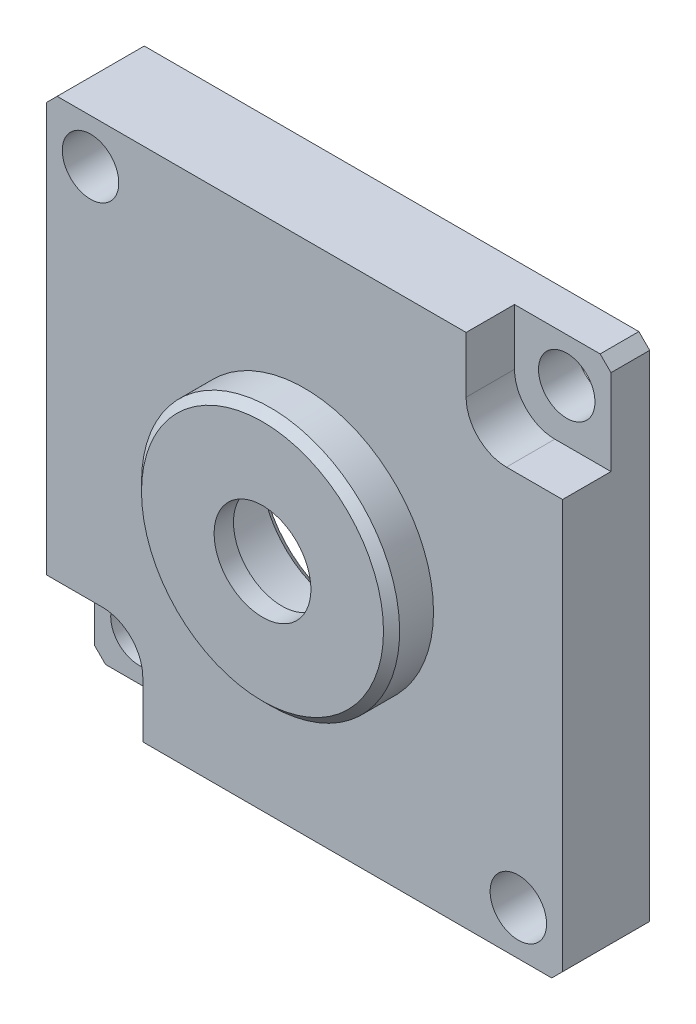
ISO-10303-21;
HEADER;
FILE_DESCRIPTION(('STEP AP214'),'2;1');
FILE_NAME('part.step','',(''),(''),'','','');
FILE_SCHEMA(('AUTOMOTIVE_DESIGN { 1 0 10303 214 1 1 1 1 }'));
ENDSEC;
DATA;
#1=APPLICATION_CONTEXT('core data for automotive mechanical design processes');
#2=APPLICATION_PROTOCOL_DEFINITION('international standard','automotive_design',2000,#1);
#3=PRODUCT_CONTEXT('',#1,'mechanical');
#4=PRODUCT('Part','Part','',(#3));
#5=PRODUCT_RELATED_PRODUCT_CATEGORY('part','',(#4));
#6=PRODUCT_DEFINITION_FORMATION('','',#4);
#7=PRODUCT_DEFINITION_CONTEXT('part definition',#1,'design');
#8=PRODUCT_DEFINITION('design','',#6,#7);
#9=PRODUCT_DEFINITION_SHAPE('','',#8);
#10=(LENGTH_UNIT() NAMED_UNIT(*) SI_UNIT(.MILLI.,.METRE.));
#11=(NAMED_UNIT(*) PLANE_ANGLE_UNIT() SI_UNIT($,.RADIAN.));
#12=(NAMED_UNIT(*) SI_UNIT($,.STERADIAN.) SOLID_ANGLE_UNIT());
#13=UNCERTAINTY_MEASURE_WITH_UNIT(LENGTH_MEASURE(1.E-05),#10,'distance_accuracy_value','');
#14=(GEOMETRIC_REPRESENTATION_CONTEXT(3) GLOBAL_UNCERTAINTY_ASSIGNED_CONTEXT((#13)) GLOBAL_UNIT_ASSIGNED_CONTEXT((#10,
#11,#12)) REPRESENTATION_CONTEXT('',''));
#15=CARTESIAN_POINT('',(0.,0.,0.));
#16=DIRECTION('',(0.,0.,1.));
#17=DIRECTION('',(1.,0.,0.));
#18=AXIS2_PLACEMENT_3D('',#15,#16,#17);
#19=CARTESIAN_POINT('',(0.,21.,6.5));
#20=DIRECTION('',(0.,0.,1.));
#21=DIRECTION('',(1.,0.,0.));
#22=AXIS2_PLACEMENT_3D('',#19,#20,#21);
#23=PLANE('',#22);
#24=CARTESIAN_POINT('',(0.,17.,6.5));
#25=DIRECTION('',(0.,0.,1.));
#26=DIRECTION('',(1.,0.,0.));
#27=AXIS2_PLACEMENT_3D('',#24,#25,#26);
#28=CIRCLE('',#27,4.);
#29=CARTESIAN_POINT('',(-4.,17.,6.5));
#30=VERTEX_POINT('',#29);
#31=EDGE_CURVE('E319',#30,#30,#28,.T.);
#32=ORIENTED_EDGE('',*,*,#31,.T.);
#33=EDGE_LOOP('',(#32));
#34=FACE_BOUND('',#33,.T.);
#35=CARTESIAN_POINT('',(0.,17.,6.5));
#36=DIRECTION('',(0.,0.,-1.));
#37=DIRECTION('',(1.,0.,0.));
#38=AXIS2_PLACEMENT_3D('',#35,#36,#37);
#39=CIRCLE('',#38,5.05);
#40=CARTESIAN_POINT('',(-5.05,17.,6.5));
#41=VERTEX_POINT('',#40);
#42=EDGE_CURVE('E316',#41,#41,#39,.T.);
#43=ORIENTED_EDGE('',*,*,#42,.T.);
#44=EDGE_LOOP('',(#43));
#45=FACE_BOUND('',#44,.T.);
#46=ADVANCED_FACE('F15',(#34,#45),#23,.F.);
#47=CARTESIAN_POINT('',(0.,21.,6.8));
#48=DIRECTION('',(0.,0.,1.));
#49=DIRECTION('',(1.,0.,0.));
#50=AXIS2_PLACEMENT_3D('',#47,#48,#49);
#51=PLANE('',#50);
#52=CARTESIAN_POINT('',(0.,17.,6.8));
#53=DIRECTION('',(0.,0.,1.));
#54=DIRECTION('',(1.,0.,0.));
#55=AXIS2_PLACEMENT_3D('',#52,#53,#54);
#56=CIRCLE('',#55,3.);
#57=CARTESIAN_POINT('',(-3.,17.,6.8));
#58=VERTEX_POINT('',#57);
#59=EDGE_CURVE('E289',#58,#58,#56,.T.);
#60=ORIENTED_EDGE('',*,*,#59,.T.);
#61=EDGE_LOOP('',(#60));
#62=FACE_BOUND('',#61,.T.);
#63=CARTESIAN_POINT('',(0.,17.,6.8));
#64=DIRECTION('',(0.,0.,1.));
#65=DIRECTION('',(1.,0.,0.));
#66=AXIS2_PLACEMENT_3D('',#63,#64,#65);
#67=CIRCLE('',#66,4.);
#68=CARTESIAN_POINT('',(-4.,17.,6.8));
#69=VERTEX_POINT('',#68);
#70=EDGE_CURVE('E234',#69,#69,#67,.T.);
#71=ORIENTED_EDGE('',*,*,#70,.F.);
#72=EDGE_LOOP('',(#71));
#73=FACE_BOUND('',#72,.T.);
#74=ADVANCED_FACE('F17',(#62,#73),#51,.F.);
#75=CARTESIAN_POINT('',(0.,30.,2.5));
#76=DIRECTION('',(0.,0.,1.));
#77=DIRECTION('',(1.,0.,0.));
#78=AXIS2_PLACEMENT_3D('',#75,#76,#77);
#79=PLANE('',#78);
#80=CARTESIAN_POINT('',(0.,17.,2.5));
#81=DIRECTION('',(0.,0.,-1.));
#82=DIRECTION('',(-1.,0.,0.));
#83=AXIS2_PLACEMENT_3D('',#80,#81,#82);
#84=CIRCLE('',#83,5.57573593122475);
#85=CARTESIAN_POINT('',(5.57573593122475,17.,2.5));
#86=VERTEX_POINT('',#85);
#87=EDGE_CURVE('E273',#86,#86,#84,.T.);
#88=ORIENTED_EDGE('',*,*,#87,.F.);
#89=EDGE_LOOP('',(#88));
#90=FACE_BOUND('',#89,.T.);
#91=CARTESIAN_POINT('',(0.,17.,2.5));
#92=DIRECTION('',(0.,0.,-1.));
#93=DIRECTION('',(1.,0.,0.));
#94=AXIS2_PLACEMENT_3D('',#91,#92,#93);
#95=CIRCLE('',#94,13.);
#96=CARTESIAN_POINT('',(-13.,17.,2.5));
#97=VERTEX_POINT('',#96);
#98=EDGE_CURVE('E294',#97,#97,#95,.T.);
#99=ORIENTED_EDGE('',*,*,#98,.T.);
#100=EDGE_LOOP('',(#99));
#101=FACE_BOUND('',#100,.T.);
#102=ADVANCED_FACE('F585',(#90,#101),#79,.F.);
#103=CARTESIAN_POINT('',(0.,25.,8.));
#104=DIRECTION('',(0.,0.,-1.));
#105=DIRECTION('',(-1.,0.,0.));
#106=AXIS2_PLACEMENT_3D('',#103,#104,#105);
#107=PLANE('',#106);
#108=CARTESIAN_POINT('',(0.,17.,8.));
#109=DIRECTION('',(0.,0.,1.));
#110=DIRECTION('',(1.,0.,0.));
#111=AXIS2_PLACEMENT_3D('',#108,#109,#110);
#112=CIRCLE('',#111,3.);
#113=CARTESIAN_POINT('',(-3.,17.,8.));
#114=VERTEX_POINT('',#113);
#115=EDGE_CURVE('E311',#114,#114,#112,.T.);
#116=ORIENTED_EDGE('',*,*,#115,.F.);
#117=EDGE_LOOP('',(#116));
#118=FACE_BOUND('',#117,.T.);
#119=CARTESIAN_POINT('',(0.,17.,8.));
#120=DIRECTION('',(0.,0.,-1.));
#121=DIRECTION('',(0.,1.,0.));
#122=AXIS2_PLACEMENT_3D('',#119,#120,#121);
#123=CIRCLE('',#122,7.5);
#124=CARTESIAN_POINT('',(0.,9.5,8.));
#125=VERTEX_POINT('',#124);
#126=EDGE_CURVE('E257',#125,#125,#123,.T.);
#127=ORIENTED_EDGE('',*,*,#126,.F.);
#128=EDGE_LOOP('',(#127));
#129=FACE_BOUND('',#128,.T.);
#130=ADVANCED_FACE('F588',(#118,#129),#107,.F.);
#131=CARTESIAN_POINT('',(-16.4142135623731,2.08578643762688,-42.4264068711929));
#132=DIRECTION('',(0.707106781186546,0.707106781186549,0.));
#133=DIRECTION('',(0.,0.,-1.));
#134=AXIS2_PLACEMENT_3D('',#131,#132,#133);
#135=PLANE('',#134);
#136=DIRECTION('',(0.,0.,1.));
#137=VECTOR('',#136,1.);
#138=CARTESIAN_POINT('',(-16.,1.6715728752538,-42.4264068711929));
#139=LINE('',#138,#137);
#140=CARTESIAN_POINT('',(-16.,1.67157287525379,0.));
#141=VERTEX_POINT('',#140);
#142=CARTESIAN_POINT('',(-16.,1.67157287525379,2.4));
#143=VERTEX_POINT('',#142);
#144=EDGE_CURVE('E399',#141,#143,#139,.T.);
#145=ORIENTED_EDGE('',*,*,#144,.F.);
#146=DIRECTION('',(0.707106781186549,-0.707106781186546,0.));
#147=VECTOR('',#146,1.);
#148=CARTESIAN_POINT('',(-19.5392135623731,5.21078643762685,0.));
#149=LINE('',#148,#147);
#150=CARTESIAN_POINT('',(-15.3284271247462,0.999999999999974,0.));
#151=VERTEX_POINT('',#150);
#152=EDGE_CURVE('E210',#141,#151,#149,.T.);
#153=ORIENTED_EDGE('',*,*,#152,.T.);
#154=DIRECTION('',(0.,0.,-1.));
#155=VECTOR('',#154,1.);
#156=CARTESIAN_POINT('',(-15.3284271247462,0.999999999999974,-42.4264068711929));
#157=LINE('',#156,#155);
#158=CARTESIAN_POINT('',(-15.3284271247462,0.999999999999974,2.4));
#159=VERTEX_POINT('',#158);
#160=EDGE_CURVE('E401',#159,#151,#157,.T.);
#161=ORIENTED_EDGE('',*,*,#160,.F.);
#162=DIRECTION('',(-0.707106781186549,0.707106781186546,0.));
#163=VECTOR('',#162,1.);
#164=CARTESIAN_POINT('',(-16.039213562373,1.71078643762683,2.4));
#165=LINE('',#164,#163);
#166=EDGE_CURVE('E329',#159,#143,#165,.T.);
#167=ORIENTED_EDGE('',*,*,#166,.T.);
#168=EDGE_LOOP('',(#145,#153,#161,#167));
#169=FACE_BOUND('',#168,.T.);
#170=ADVANCED_FACE('F554',(#169),#135,.F.);
#171=CARTESIAN_POINT('',(-14.9142135623731,33.4142135623731,-42.4264068711929));
#172=DIRECTION('',(0.707106781186549,-0.707106781186546,0.));
#173=DIRECTION('',(0.,0.,-1.));
#174=AXIS2_PLACEMENT_3D('',#171,#172,#173);
#175=PLANE('',#174);
#176=DIRECTION('',(0.,0.,1.));
#177=VECTOR('',#176,1.);
#178=CARTESIAN_POINT('',(-15.3284271247462,33.,-42.4264068711929));
#179=LINE('',#178,#177);
#180=CARTESIAN_POINT('',(-15.3284271247462,33.,0.));
#181=VERTEX_POINT('',#180);
#182=CARTESIAN_POINT('',(-15.3284271247462,33.,5.4));
#183=VERTEX_POINT('',#182);
#184=EDGE_CURVE('E457',#181,#183,#179,.T.);
#185=ORIENTED_EDGE('',*,*,#184,.F.);
#186=DIRECTION('',(-0.707106781186546,-0.707106781186549,0.));
#187=VECTOR('',#186,1.);
#188=CARTESIAN_POINT('',(-11.7892135623731,36.5392135623731,0.));
#189=LINE('',#188,#187);
#190=CARTESIAN_POINT('',(-16.,32.3284271247462,0.));
#191=VERTEX_POINT('',#190);
#192=EDGE_CURVE('E26',#181,#191,#189,.T.);
#193=ORIENTED_EDGE('',*,*,#192,.T.);
#194=DIRECTION('',(0.,0.,-1.));
#195=VECTOR('',#194,1.);
#196=CARTESIAN_POINT('',(-16.,32.3284271247462,-42.4264068711929));
#197=LINE('',#196,#195);
#198=CARTESIAN_POINT('',(-16.,32.3284271247462,5.4));
#199=VERTEX_POINT('',#198);
#200=EDGE_CURVE('E460',#199,#191,#197,.T.);
#201=ORIENTED_EDGE('',*,*,#200,.F.);
#202=DIRECTION('',(0.707106781186546,0.707106781186549,0.));
#203=VECTOR('',#202,1.);
#204=CARTESIAN_POINT('',(-15.2892135623731,33.039213562373,5.4));
#205=LINE('',#204,#203);
#206=EDGE_CURVE('E237',#199,#183,#205,.T.);
#207=ORIENTED_EDGE('',*,*,#206,.T.);
#208=EDGE_LOOP('',(#185,#193,#201,#207));
#209=FACE_BOUND('',#208,.T.);
#210=ADVANCED_FACE('F651',(#209),#175,.F.);
#211=CARTESIAN_POINT('',(14.9142135623731,0.585786437626887,-42.4264068711929));
#212=DIRECTION('',(-0.707106781186549,0.707106781186546,0.));
#213=DIRECTION('',(0.,0.,1.));
#214=AXIS2_PLACEMENT_3D('',#211,#212,#213);
#215=PLANE('',#214);
#216=DIRECTION('',(0.,0.,1.));
#217=VECTOR('',#216,1.);
#218=CARTESIAN_POINT('',(15.3284271247462,0.999999999999974,-42.4264068711929));
#219=LINE('',#218,#217);
#220=CARTESIAN_POINT('',(15.3284271247462,0.999999999999974,0.));
#221=VERTEX_POINT('',#220);
#222=CARTESIAN_POINT('',(15.3284271247462,0.999999999999974,5.4));
#223=VERTEX_POINT('',#222);
#224=EDGE_CURVE('E211',#221,#223,#219,.T.);
#225=ORIENTED_EDGE('',*,*,#224,.F.);
#226=DIRECTION('',(0.707106781186546,0.707106781186549,0.));
#227=VECTOR('',#226,1.);
#228=CARTESIAN_POINT('',(18.7892135623731,4.46078643762692,0.));
#229=LINE('',#228,#227);
#230=CARTESIAN_POINT('',(16.,1.67157287525379,0.));
#231=VERTEX_POINT('',#230);
#232=EDGE_CURVE('E10',#221,#231,#229,.T.);
#233=ORIENTED_EDGE('',*,*,#232,.T.);
#234=DIRECTION('',(0.,0.,-1.));
#235=VECTOR('',#234,1.);
#236=CARTESIAN_POINT('',(16.,1.67157287525379,-42.4264068711929));
#237=LINE('',#236,#235);
#238=CARTESIAN_POINT('',(16.,1.67157287525379,5.4));
#239=VERTEX_POINT('',#238);
#240=EDGE_CURVE('E227',#239,#231,#237,.T.);
#241=ORIENTED_EDGE('',*,*,#240,.F.);
#242=DIRECTION('',(-0.707106781186546,-0.707106781186549,0.));
#243=VECTOR('',#242,1.);
#244=CARTESIAN_POINT('',(15.2892135623731,0.96078643762691,5.4));
#245=LINE('',#244,#243);
#246=EDGE_CURVE('E430',#239,#223,#245,.T.);
#247=ORIENTED_EDGE('',*,*,#246,.T.);
#248=EDGE_LOOP('',(#225,#233,#241,#247));
#249=FACE_BOUND('',#248,.T.);
#250=ADVANCED_FACE('F599',(#249),#215,.F.);
#251=CARTESIAN_POINT('',(0.,31.,0.));
#252=DIRECTION('',(0.,0.,1.));
#253=DIRECTION('',(1.,0.,0.));
#254=AXIS2_PLACEMENT_3D('',#251,#252,#253);
#255=PLANE('',#254);
#256=CARTESIAN_POINT('',(0.,17.,0.));
#257=DIRECTION('',(0.,0.,-1.));
#258=DIRECTION('',(1.,0.,0.));
#259=AXIS2_PLACEMENT_3D('',#256,#257,#258);
#260=CIRCLE('',#259,13.);
#261=CARTESIAN_POINT('',(-13.,17.,0.));
#262=VERTEX_POINT('',#261);
#263=EDGE_CURVE('E261',#262,#262,#260,.T.);
#264=ORIENTED_EDGE('',*,*,#263,.F.);
#265=EDGE_LOOP('',(#264));
#266=FACE_BOUND('',#265,.T.);
#267=CARTESIAN_POINT('',(13.2582521472478,3.74174785275217,0.));
#268=DIRECTION('',(0.,0.,1.));
#269=DIRECTION('',(1.,0.,0.));
#270=AXIS2_PLACEMENT_3D('',#267,#268,#269);
#271=CIRCLE('',#270,1.75);
#272=CARTESIAN_POINT('',(11.5082521472478,3.74174785275217,0.));
#273=VERTEX_POINT('',#272);
#274=EDGE_CURVE('E360',#273,#273,#271,.T.);
#275=ORIENTED_EDGE('',*,*,#274,.T.);
#276=EDGE_LOOP('',(#275));
#277=FACE_BOUND('',#276,.T.);
#278=CARTESIAN_POINT('',(13.2582521472478,30.2582521472478,0.));
#279=DIRECTION('',(0.,0.,1.));
#280=DIRECTION('',(1.,0.,0.));
#281=AXIS2_PLACEMENT_3D('',#278,#279,#280);
#282=CIRCLE('',#281,1.75);
#283=CARTESIAN_POINT('',(11.5082521472478,30.2582521472478,0.));
#284=VERTEX_POINT('',#283);
#285=EDGE_CURVE('E271',#284,#284,#282,.T.);
#286=ORIENTED_EDGE('',*,*,#285,.T.);
#287=EDGE_LOOP('',(#286));
#288=FACE_BOUND('',#287,.T.);
#289=CARTESIAN_POINT('',(-13.2582521472479,3.74174785275228,0.));
#290=DIRECTION('',(0.,0.,1.));
#291=DIRECTION('',(1.,0.,0.));
#292=AXIS2_PLACEMENT_3D('',#289,#290,#291);
#293=CIRCLE('',#292,1.75);
#294=CARTESIAN_POINT('',(-15.0082521472479,3.74174785275228,0.));
#295=VERTEX_POINT('',#294);
#296=EDGE_CURVE('E272',#295,#295,#293,.T.);
#297=ORIENTED_EDGE('',*,*,#296,.T.);
#298=EDGE_LOOP('',(#297));
#299=FACE_BOUND('',#298,.T.);
#300=CARTESIAN_POINT('',(-13.2582521472478,30.2582521472478,0.));
#301=DIRECTION('',(0.,0.,1.));
#302=DIRECTION('',(1.,0.,0.));
#303=AXIS2_PLACEMENT_3D('',#300,#301,#302);
#304=CIRCLE('',#303,1.75);
#305=CARTESIAN_POINT('',(-15.0082521472478,30.2582521472478,0.));
#306=VERTEX_POINT('',#305);
#307=EDGE_CURVE('E288',#306,#306,#304,.T.);
#308=ORIENTED_EDGE('',*,*,#307,.T.);
#309=EDGE_LOOP('',(#308));
#310=FACE_BOUND('',#309,.T.);
#311=ORIENTED_EDGE('',*,*,#152,.F.);
#312=DIRECTION('',(0.,-1.,0.));
#313=VECTOR('',#312,1.);
#314=CARTESIAN_POINT('',(-16.,16.5,0.));
#315=LINE('',#314,#313);
#316=EDGE_CURVE('E402',#191,#141,#315,.T.);
#317=ORIENTED_EDGE('',*,*,#316,.F.);
#318=ORIENTED_EDGE('',*,*,#192,.F.);
#319=DIRECTION('',(-1.,0.,0.));
#320=VECTOR('',#319,1.);
#321=CARTESIAN_POINT('',(-7.5,33.,0.));
#322=LINE('',#321,#320);
#323=CARTESIAN_POINT('',(15.3284271247462,33.,0.));
#324=VERTEX_POINT('',#323);
#325=EDGE_CURVE('E206',#324,#181,#322,.T.);
#326=ORIENTED_EDGE('',*,*,#325,.F.);
#327=DIRECTION('',(0.707106781186549,-0.707106781186546,0.));
#328=VECTOR('',#327,1.);
#329=CARTESIAN_POINT('',(12.5392135623731,35.7892135623731,0.));
#330=LINE('',#329,#328);
#331=CARTESIAN_POINT('',(16.,32.3284271247462,0.));
#332=VERTEX_POINT('',#331);
#333=EDGE_CURVE('E199',#324,#332,#330,.T.);
#334=ORIENTED_EDGE('',*,*,#333,.T.);
#335=DIRECTION('',(0.,1.,0.));
#336=VECTOR('',#335,1.);
#337=CARTESIAN_POINT('',(16.,16.5,0.));
#338=LINE('',#337,#336);
#339=EDGE_CURVE('E203',#231,#332,#338,.T.);
#340=ORIENTED_EDGE('',*,*,#339,.F.);
#341=ORIENTED_EDGE('',*,*,#232,.F.);
#342=DIRECTION('',(1.,0.,0.));
#343=VECTOR('',#342,1.);
#344=CARTESIAN_POINT('',(-7.5,0.999999999999974,0.));
#345=LINE('',#344,#343);
#346=EDGE_CURVE('E416',#151,#221,#345,.T.);
#347=ORIENTED_EDGE('',*,*,#346,.F.);
#348=EDGE_LOOP('',(#311,#317,#318,#326,#334,#340,#341,#347));
#349=FACE_BOUND('',#348,.T.);
#350=ADVANCED_FACE('F201',(#266,#277,#288,#299,#310,#349),#255,.F.);
#351=CARTESIAN_POINT('',(16.4142135623731,31.9142135623731,-42.4264068711929));
#352=DIRECTION('',(-0.707106781186546,-0.707106781186549,0.));
#353=DIRECTION('',(-0.707106781186549,0.707106781186546,0.));
#354=AXIS2_PLACEMENT_3D('',#351,#352,#353);
#355=PLANE('',#354);
#356=DIRECTION('',(0.,0.,1.));
#357=VECTOR('',#356,1.);
#358=CARTESIAN_POINT('',(16.,32.3284271247462,-42.4264068711929));
#359=LINE('',#358,#357);
#360=CARTESIAN_POINT('',(16.,32.3284271247462,2.4));
#361=VERTEX_POINT('',#360);
#362=EDGE_CURVE('E215',#332,#361,#359,.T.);
#363=ORIENTED_EDGE('',*,*,#362,.F.);
#364=ORIENTED_EDGE('',*,*,#333,.F.);
#365=DIRECTION('',(0.,0.,-1.));
#366=VECTOR('',#365,1.);
#367=CARTESIAN_POINT('',(15.3284271247462,33.,-42.4264068711929));
#368=LINE('',#367,#366);
#369=CARTESIAN_POINT('',(15.3284271247462,33.,2.4));
#370=VERTEX_POINT('',#369);
#371=EDGE_CURVE('E223',#370,#324,#368,.T.);
#372=ORIENTED_EDGE('',*,*,#371,.F.);
#373=DIRECTION('',(0.707106781186549,-0.707106781186546,0.));
#374=VECTOR('',#373,1.);
#375=CARTESIAN_POINT('',(16.039213562373,32.2892135623732,2.4));
#376=LINE('',#375,#374);
#377=EDGE_CURVE('E218',#370,#361,#376,.T.);
#378=ORIENTED_EDGE('',*,*,#377,.T.);
#379=EDGE_LOOP('',(#363,#364,#372,#378));
#380=FACE_BOUND('',#379,.T.);
#381=ADVANCED_FACE('F216',(#380),#355,.F.);
#382=CARTESIAN_POINT('',(-15.,0.999999999999974,-42.4264068711929));
#383=DIRECTION('',(0.,-1.,0.));
#384=DIRECTION('',(0.,0.,-1.));
#385=AXIS2_PLACEMENT_3D('',#382,#383,#384);
#386=PLANE('',#385);
#387=DIRECTION('',(-1.,0.,0.));
#388=VECTOR('',#387,1.);
#389=CARTESIAN_POINT('',(-1.73959235991432,0.999999999999974,5.4));
#390=LINE('',#389,#388);
#391=CARTESIAN_POINT('',(-10.0208152801712,0.999999999999974,5.4));
#392=VERTEX_POINT('',#391);
#393=EDGE_CURVE('E244',#223,#392,#390,.T.);
#394=ORIENTED_EDGE('',*,*,#393,.T.);
#395=DIRECTION('',(0.,0.,-1.));
#396=VECTOR('',#395,1.);
#397=CARTESIAN_POINT('',(-10.0208152801712,0.99999999999997,-20.0132034355964));
#398=LINE('',#397,#396);
#399=CARTESIAN_POINT('',(-10.0208152801712,0.999999999999974,2.4));
#400=VERTEX_POINT('',#399);
#401=EDGE_CURVE('E266',#392,#400,#398,.T.);
#402=ORIENTED_EDGE('',*,*,#401,.T.);
#403=DIRECTION('',(-1.,0.,0.));
#404=VECTOR('',#403,1.);
#405=CARTESIAN_POINT('',(-13.2604076400856,0.999999999999974,2.4));
#406=LINE('',#405,#404);
#407=EDGE_CURVE('E304',#400,#159,#406,.T.);
#408=ORIENTED_EDGE('',*,*,#407,.T.);
#409=ORIENTED_EDGE('',*,*,#160,.T.);
#410=ORIENTED_EDGE('',*,*,#346,.T.);
#411=ORIENTED_EDGE('',*,*,#224,.T.);
#412=EDGE_LOOP('',(#394,#402,#408,#409,#410,#411));
#413=FACE_BOUND('',#412,.T.);
#414=ADVANCED_FACE('F556',(#413),#386,.T.);
#415=CARTESIAN_POINT('',(-16.,2.,-42.4264068711929));
#416=DIRECTION('',(-1.,0.,0.));
#417=DIRECTION('',(0.,1.,0.));
#418=AXIS2_PLACEMENT_3D('',#415,#416,#417);
#419=PLANE('',#418);
#420=DIRECTION('',(0.,1.,0.));
#421=VECTOR('',#420,1.);
#422=CARTESIAN_POINT('',(-16.,13.5,5.4));
#423=LINE('',#422,#421);
#424=CARTESIAN_POINT('',(-16.,6.97918471982857,5.4));
#425=VERTEX_POINT('',#424);
#426=EDGE_CURVE('E246',#425,#199,#423,.T.);
#427=ORIENTED_EDGE('',*,*,#426,.T.);
#428=ORIENTED_EDGE('',*,*,#200,.T.);
#429=ORIENTED_EDGE('',*,*,#316,.T.);
#430=ORIENTED_EDGE('',*,*,#144,.T.);
#431=DIRECTION('',(0.,1.,0.));
#432=VECTOR('',#431,1.);
#433=CARTESIAN_POINT('',(-16.,3.73959235991428,2.4));
#434=LINE('',#433,#432);
#435=CARTESIAN_POINT('',(-16.,6.97918471982857,2.4));
#436=VERTEX_POINT('',#435);
#437=EDGE_CURVE('E328',#143,#436,#434,.T.);
#438=ORIENTED_EDGE('',*,*,#437,.T.);
#439=DIRECTION('',(0.,0.,1.));
#440=VECTOR('',#439,1.);
#441=CARTESIAN_POINT('',(-16.,6.97918471982856,-20.0132034355964));
#442=LINE('',#441,#440);
#443=EDGE_CURVE('E335',#436,#425,#442,.T.);
#444=ORIENTED_EDGE('',*,*,#443,.T.);
#445=EDGE_LOOP('',(#427,#428,#429,#430,#438,#444));
#446=FACE_BOUND('',#445,.T.);
#447=ADVANCED_FACE('F516',(#446),#419,.T.);
#448=CARTESIAN_POINT('',(-15.,33.,-42.4264068711929));
#449=DIRECTION('',(0.,1.,0.));
#450=DIRECTION('',(1.,0.,0.));
#451=AXIS2_PLACEMENT_3D('',#448,#449,#450);
#452=PLANE('',#451);
#453=DIRECTION('',(1.,0.,0.));
#454=VECTOR('',#453,1.);
#455=CARTESIAN_POINT('',(-13.2604076400857,33.,5.4));
#456=LINE('',#455,#454);
#457=CARTESIAN_POINT('',(10.0208152801711,33.,5.4));
#458=VERTEX_POINT('',#457);
#459=EDGE_CURVE('E371',#183,#458,#456,.T.);
#460=ORIENTED_EDGE('',*,*,#459,.T.);
#461=DIRECTION('',(0.,0.,-1.));
#462=VECTOR('',#461,1.);
#463=CARTESIAN_POINT('',(10.0208152801711,33.,-20.0132034355964));
#464=LINE('',#463,#462);
#465=CARTESIAN_POINT('',(10.0208152801711,33.,2.4));
#466=VERTEX_POINT('',#465);
#467=EDGE_CURVE('E404',#458,#466,#464,.T.);
#468=ORIENTED_EDGE('',*,*,#467,.T.);
#469=DIRECTION('',(1.,0.,0.));
#470=VECTOR('',#469,1.);
#471=CARTESIAN_POINT('',(-1.73959235991443,33.,2.4));
#472=LINE('',#471,#470);
#473=EDGE_CURVE('E245',#466,#370,#472,.T.);
#474=ORIENTED_EDGE('',*,*,#473,.T.);
#475=ORIENTED_EDGE('',*,*,#371,.T.);
#476=ORIENTED_EDGE('',*,*,#325,.T.);
#477=ORIENTED_EDGE('',*,*,#184,.T.);
#478=EDGE_LOOP('',(#460,#468,#474,#475,#476,#477));
#479=FACE_BOUND('',#478,.T.);
#480=ADVANCED_FACE('F666',(#479),#452,.T.);
#481=CARTESIAN_POINT('',(16.,2.,-42.4264068711929));
#482=DIRECTION('',(1.,0.,0.));
#483=DIRECTION('',(0.,0.,-1.));
#484=AXIS2_PLACEMENT_3D('',#481,#482,#483);
#485=PLANE('',#484);
#486=DIRECTION('',(0.,-1.,0.));
#487=VECTOR('',#486,1.);
#488=CARTESIAN_POINT('',(16.,13.5,5.4));
#489=LINE('',#488,#487);
#490=CARTESIAN_POINT('',(16.,27.0208152801715,5.4));
#491=VERTEX_POINT('',#490);
#492=EDGE_CURVE('E374',#491,#239,#489,.T.);
#493=ORIENTED_EDGE('',*,*,#492,.T.);
#494=ORIENTED_EDGE('',*,*,#240,.T.);
#495=ORIENTED_EDGE('',*,*,#339,.T.);
#496=ORIENTED_EDGE('',*,*,#362,.T.);
#497=DIRECTION('',(0.,-1.,0.));
#498=VECTOR('',#497,1.);
#499=CARTESIAN_POINT('',(16.,15.2604076400857,2.4));
#500=LINE('',#499,#498);
#501=CARTESIAN_POINT('',(16.,27.0208152801715,2.4));
#502=VERTEX_POINT('',#501);
#503=EDGE_CURVE('E425',#361,#502,#500,.T.);
#504=ORIENTED_EDGE('',*,*,#503,.T.);
#505=DIRECTION('',(0.,0.,1.));
#506=VECTOR('',#505,1.);
#507=CARTESIAN_POINT('',(16.,27.0208152801715,-20.0132034355964));
#508=LINE('',#507,#506);
#509=EDGE_CURVE('E347',#502,#491,#508,.T.);
#510=ORIENTED_EDGE('',*,*,#509,.T.);
#511=EDGE_LOOP('',(#493,#494,#495,#496,#504,#510));
#512=FACE_BOUND('',#511,.T.);
#513=ADVANCED_FACE('F226',(#512),#485,.T.);
#514=CARTESIAN_POINT('',(0.,17.,5.4));
#515=DIRECTION('',(0.,0.,1.));
#516=DIRECTION('',(1.,0.,0.));
#517=AXIS2_PLACEMENT_3D('',#514,#515,#516);
#518=CYLINDRICAL_SURFACE('',#517,4.);
#519=ORIENTED_EDGE('',*,*,#31,.F.);
#520=DIRECTION('',(0.,0.,1.));
#521=VECTOR('',#520,1.);
#522=CARTESIAN_POINT('',(-4.,17.,5.4));
#523=LINE('',#522,#521);
#524=EDGE_CURVE('E281',#30,#69,#523,.T.);
#525=ORIENTED_EDGE('',*,*,#524,.T.);
#526=ORIENTED_EDGE('',*,*,#70,.T.);
#527=ORIENTED_EDGE('',*,*,#524,.F.);
#528=EDGE_LOOP('',(#519,#525,#526,#527));
#529=FACE_BOUND('',#528,.T.);
#530=ADVANCED_FACE('F647',(#529),#518,.F.);
#531=CARTESIAN_POINT('',(0.,17.,5.4));
#532=DIRECTION('',(0.,0.,1.));
#533=DIRECTION('',(1.,0.,0.));
#534=AXIS2_PLACEMENT_3D('',#531,#532,#533);
#535=CYLINDRICAL_SURFACE('',#534,5.05);
#536=CARTESIAN_POINT('',(0.,17.,3.02573593116499));
#537=DIRECTION('',(0.,0.,-1.));
#538=DIRECTION('',(1.,0.,0.));
#539=AXIS2_PLACEMENT_3D('',#536,#537,#538);
#540=CIRCLE('',#539,5.05);
#541=CARTESIAN_POINT('',(-5.05,17.,3.02573593116499));
#542=VERTEX_POINT('',#541);
#543=CARTESIAN_POINT('',(5.05,17.,3.02573593116499));
#544=VERTEX_POINT('',#543);
#545=EDGE_CURVE('E315',#542,#544,#540,.T.);
#546=ORIENTED_EDGE('',*,*,#545,.T.);
#547=CARTESIAN_POINT('',(0.,17.,3.02573593116499));
#548=DIRECTION('',(0.,0.,-1.));
#549=DIRECTION('',(1.,0.,0.));
#550=AXIS2_PLACEMENT_3D('',#547,#548,#549);
#551=CIRCLE('',#550,5.05);
#552=EDGE_CURVE('E453',#544,#542,#551,.T.);
#553=ORIENTED_EDGE('',*,*,#552,.T.);
#554=DIRECTION('',(0.,0.,1.));
#555=VECTOR('',#554,1.);
#556=CARTESIAN_POINT('',(-5.05,17.,5.4));
#557=LINE('',#556,#555);
#558=EDGE_CURVE('E277',#542,#41,#557,.T.);
#559=ORIENTED_EDGE('',*,*,#558,.T.);
#560=ORIENTED_EDGE('',*,*,#42,.F.);
#561=ORIENTED_EDGE('',*,*,#558,.F.);
#562=EDGE_LOOP('',(#546,#553,#559,#560,#561));
#563=FACE_BOUND('',#562,.T.);
#564=ADVANCED_FACE('F578',(#563),#535,.F.);
#565=CARTESIAN_POINT('',(0.,17.,2.28786796567781));
#566=DIRECTION('',(0.,0.,-1.));
#567=DIRECTION('',(-1.,0.,0.));
#568=AXIS2_PLACEMENT_3D('',#565,#566,#567);
#569=CONICAL_SURFACE('',#568,5.78786796557106,0.785398163454292);
#570=ORIENTED_EDGE('',*,*,#545,.F.);
#571=ORIENTED_EDGE('',*,*,#552,.F.);
#572=DIRECTION('',(0.707106781226742,0.,-0.707106781146353));
#573=VECTOR('',#572,1.);
#574=CARTESIAN_POINT('',(5.78786796557106,17.,2.28786796567781));
#575=LINE('',#574,#573);
#576=EDGE_CURVE('E278',#544,#86,#575,.T.);
#577=ORIENTED_EDGE('',*,*,#576,.T.);
#578=ORIENTED_EDGE('',*,*,#87,.T.);
#579=ORIENTED_EDGE('',*,*,#576,.F.);
#580=EDGE_LOOP('',(#570,#571,#577,#578,#579));
#581=FACE_BOUND('',#580,.T.);
#582=ADVANCED_FACE('F582',(#581),#569,.F.);
#583=CARTESIAN_POINT('',(0.,17.,5.4));
#584=DIRECTION('',(0.,0.,1.));
#585=DIRECTION('',(1.,0.,0.));
#586=AXIS2_PLACEMENT_3D('',#583,#584,#585);
#587=CYLINDRICAL_SURFACE('',#586,3.);
#588=ORIENTED_EDGE('',*,*,#59,.F.);
#589=DIRECTION('',(0.,0.,1.));
#590=VECTOR('',#589,1.);
#591=CARTESIAN_POINT('',(-3.,17.,5.4));
#592=LINE('',#591,#590);
#593=EDGE_CURVE('E293',#58,#114,#592,.T.);
#594=ORIENTED_EDGE('',*,*,#593,.T.);
#595=ORIENTED_EDGE('',*,*,#115,.T.);
#596=ORIENTED_EDGE('',*,*,#593,.F.);
#597=EDGE_LOOP('',(#588,#594,#595,#596));
#598=FACE_BOUND('',#597,.T.);
#599=ADVANCED_FACE('F667',(#598),#587,.F.);
#600=CARTESIAN_POINT('',(0.,17.,5.4));
#601=DIRECTION('',(0.,0.,1.));
#602=DIRECTION('',(1.,0.,0.));
#603=AXIS2_PLACEMENT_3D('',#600,#601,#602);
#604=CYLINDRICAL_SURFACE('',#603,13.);
#605=ORIENTED_EDGE('',*,*,#263,.T.);
#606=DIRECTION('',(0.,0.,1.));
#607=VECTOR('',#606,1.);
#608=CARTESIAN_POINT('',(-13.,17.,5.4));
#609=LINE('',#608,#607);
#610=EDGE_CURVE('E298',#262,#97,#609,.T.);
#611=ORIENTED_EDGE('',*,*,#610,.T.);
#612=ORIENTED_EDGE('',*,*,#98,.F.);
#613=ORIENTED_EDGE('',*,*,#610,.F.);
#614=EDGE_LOOP('',(#605,#611,#612,#613));
#615=FACE_BOUND('',#614,.T.);
#616=ADVANCED_FACE('F594',(#615),#604,.F.);
#617=CARTESIAN_POINT('',(0.,17.,7.5));
#618=DIRECTION('',(0.,0.,-1.));
#619=DIRECTION('',(0.,1.,0.));
#620=AXIS2_PLACEMENT_3D('',#617,#618,#619);
#621=CONICAL_SURFACE('',#620,8.,0.785398163397444);
#622=CARTESIAN_POINT('',(0.,17.,7.5));
#623=DIRECTION('',(0.,0.,-1.));
#624=DIRECTION('',(1.,0.,0.));
#625=AXIS2_PLACEMENT_3D('',#622,#623,#624);
#626=CIRCLE('',#625,8.);
#627=CARTESIAN_POINT('',(-8.,17.,7.5));
#628=VERTEX_POINT('',#627);
#629=CARTESIAN_POINT('',(0.,9.,7.5));
#630=VERTEX_POINT('',#629);
#631=EDGE_CURVE('E251',#628,#630,#626,.T.);
#632=ORIENTED_EDGE('',*,*,#631,.F.);
#633=CARTESIAN_POINT('',(0.,17.,7.5));
#634=DIRECTION('',(0.,0.,-1.));
#635=DIRECTION('',(1.,0.,0.));
#636=AXIS2_PLACEMENT_3D('',#633,#634,#635);
#637=CIRCLE('',#636,8.);
#638=EDGE_CURVE('E255',#630,#628,#637,.T.);
#639=ORIENTED_EDGE('',*,*,#638,.F.);
#640=DIRECTION('',(0.,0.707106781186545,0.70710678118655));
#641=VECTOR('',#640,1.);
#642=CARTESIAN_POINT('',(0.,9.,7.5));
#643=LINE('',#642,#641);
#644=EDGE_CURVE('E19',#630,#125,#643,.T.);
#645=ORIENTED_EDGE('',*,*,#644,.T.);
#646=ORIENTED_EDGE('',*,*,#126,.T.);
#647=ORIENTED_EDGE('',*,*,#644,.F.);
#648=EDGE_LOOP('',(#632,#639,#645,#646,#647));
#649=FACE_BOUND('',#648,.T.);
#650=ADVANCED_FACE('F662',(#649),#621,.T.);
#651=CARTESIAN_POINT('',(0.,17.,5.4));
#652=DIRECTION('',(0.,0.,1.));
#653=DIRECTION('',(1.,0.,0.));
#654=AXIS2_PLACEMENT_3D('',#651,#652,#653);
#655=CYLINDRICAL_SURFACE('',#654,8.);
#656=ORIENTED_EDGE('',*,*,#631,.T.);
#657=ORIENTED_EDGE('',*,*,#638,.T.);
#658=DIRECTION('',(0.,0.,-1.));
#659=VECTOR('',#658,1.);
#660=CARTESIAN_POINT('',(-8.,17.,5.4));
#661=LINE('',#660,#659);
#662=CARTESIAN_POINT('',(-8.,17.,5.4));
#663=VERTEX_POINT('',#662);
#664=EDGE_CURVE('E323',#628,#663,#661,.T.);
#665=ORIENTED_EDGE('',*,*,#664,.T.);
#666=CARTESIAN_POINT('',(0.,17.,5.4));
#667=DIRECTION('',(0.,0.,1.));
#668=DIRECTION('',(1.,0.,0.));
#669=AXIS2_PLACEMENT_3D('',#666,#667,#668);
#670=CIRCLE('',#669,8.);
#671=EDGE_CURVE('E375',#663,#663,#670,.T.);
#672=ORIENTED_EDGE('',*,*,#671,.T.);
#673=ORIENTED_EDGE('',*,*,#664,.F.);
#674=EDGE_LOOP('',(#656,#657,#665,#672,#673));
#675=FACE_BOUND('',#674,.T.);
#676=ADVANCED_FACE('F658',(#675),#655,.T.);
#677=CARTESIAN_POINT('',(13.2582521472478,3.74174785275217,0.));
#678=DIRECTION('',(0.,0.,1.));
#679=DIRECTION('',(1.,0.,0.));
#680=AXIS2_PLACEMENT_3D('',#677,#678,#679);
#681=CYLINDRICAL_SURFACE('',#680,1.75);
#682=ORIENTED_EDGE('',*,*,#274,.F.);
#683=DIRECTION('',(0.,0.,1.));
#684=VECTOR('',#683,1.);
#685=CARTESIAN_POINT('',(11.5082521472478,3.74174785275217,0.));
#686=LINE('',#685,#684);
#687=CARTESIAN_POINT('',(11.5082521472478,3.74174785275217,5.4));
#688=VERTEX_POINT('',#687);
#689=EDGE_CURVE('E256',#273,#688,#686,.T.);
#690=ORIENTED_EDGE('',*,*,#689,.T.);
#691=CARTESIAN_POINT('',(13.2582521472478,3.74174785275217,5.4));
#692=DIRECTION('',(0.,0.,-1.));
#693=DIRECTION('',(1.,0.,0.));
#694=AXIS2_PLACEMENT_3D('',#691,#692,#693);
#695=CIRCLE('',#694,1.75);
#696=EDGE_CURVE('E370',#688,#688,#695,.T.);
#697=ORIENTED_EDGE('',*,*,#696,.F.);
#698=ORIENTED_EDGE('',*,*,#689,.F.);
#699=EDGE_LOOP('',(#682,#690,#697,#698));
#700=FACE_BOUND('',#699,.T.);
#701=ADVANCED_FACE('F661',(#700),#681,.F.);
#702=CARTESIAN_POINT('',(13.2582521472478,30.2582521472478,0.));
#703=DIRECTION('',(0.,0.,1.));
#704=DIRECTION('',(1.,0.,0.));
#705=AXIS2_PLACEMENT_3D('',#702,#703,#704);
#706=CYLINDRICAL_SURFACE('',#705,1.75);
#707=ORIENTED_EDGE('',*,*,#285,.F.);
#708=DIRECTION('',(0.,0.,1.));
#709=VECTOR('',#708,1.);
#710=CARTESIAN_POINT('',(11.5082521472478,30.2582521472478,0.));
#711=LINE('',#710,#709);
#712=CARTESIAN_POINT('',(11.5082521472478,30.2582521472478,2.4));
#713=VERTEX_POINT('',#712);
#714=EDGE_CURVE('E379',#284,#713,#711,.T.);
#715=ORIENTED_EDGE('',*,*,#714,.T.);
#716=CARTESIAN_POINT('',(13.2582521472478,30.2582521472478,2.4));
#717=DIRECTION('',(0.,0.,-1.));
#718=DIRECTION('',(1.,0.,0.));
#719=AXIS2_PLACEMENT_3D('',#716,#717,#718);
#720=CIRCLE('',#719,1.75);
#721=EDGE_CURVE('E240',#713,#713,#720,.T.);
#722=ORIENTED_EDGE('',*,*,#721,.F.);
#723=ORIENTED_EDGE('',*,*,#714,.F.);
#724=EDGE_LOOP('',(#707,#715,#722,#723));
#725=FACE_BOUND('',#724,.T.);
#726=ADVANCED_FACE('F641',(#725),#706,.F.);
#727=CARTESIAN_POINT('',(-13.2582521472479,3.74174785275228,0.));
#728=DIRECTION('',(0.,0.,1.));
#729=DIRECTION('',(1.,0.,0.));
#730=AXIS2_PLACEMENT_3D('',#727,#728,#729);
#731=CYLINDRICAL_SURFACE('',#730,1.75);
#732=ORIENTED_EDGE('',*,*,#296,.F.);
#733=DIRECTION('',(0.,0.,1.));
#734=VECTOR('',#733,1.);
#735=CARTESIAN_POINT('',(-15.0082521472479,3.74174785275228,0.));
#736=LINE('',#735,#734);
#737=CARTESIAN_POINT('',(-15.0082521472479,3.74174785275228,2.4));
#738=VERTEX_POINT('',#737);
#739=EDGE_CURVE('E268',#295,#738,#736,.T.);
#740=ORIENTED_EDGE('',*,*,#739,.T.);
#741=CARTESIAN_POINT('',(-13.2582521472479,3.74174785275228,2.4));
#742=DIRECTION('',(0.,0.,-1.));
#743=DIRECTION('',(1.,0.,0.));
#744=AXIS2_PLACEMENT_3D('',#741,#742,#743);
#745=CIRCLE('',#744,1.75);
#746=EDGE_CURVE('E299',#738,#738,#745,.T.);
#747=ORIENTED_EDGE('',*,*,#746,.F.);
#748=ORIENTED_EDGE('',*,*,#739,.F.);
#749=EDGE_LOOP('',(#732,#740,#747,#748));
#750=FACE_BOUND('',#749,.T.);
#751=ADVANCED_FACE('F628',(#750),#731,.F.);
#752=CARTESIAN_POINT('',(-13.2582521472478,30.2582521472478,0.));
#753=DIRECTION('',(0.,0.,1.));
#754=DIRECTION('',(1.,0.,0.));
#755=AXIS2_PLACEMENT_3D('',#752,#753,#754);
#756=CYLINDRICAL_SURFACE('',#755,1.75);
#757=ORIENTED_EDGE('',*,*,#307,.F.);
#758=DIRECTION('',(0.,0.,1.));
#759=VECTOR('',#758,1.);
#760=CARTESIAN_POINT('',(-15.0082521472478,30.2582521472478,0.));
#761=LINE('',#760,#759);
#762=CARTESIAN_POINT('',(-15.0082521472478,30.2582521472478,5.4));
#763=VERTEX_POINT('',#762);
#764=EDGE_CURVE('E285',#306,#763,#761,.T.);
#765=ORIENTED_EDGE('',*,*,#764,.T.);
#766=CARTESIAN_POINT('',(-13.2582521472478,30.2582521472478,5.4));
#767=DIRECTION('',(0.,0.,-1.));
#768=DIRECTION('',(1.,0.,0.));
#769=AXIS2_PLACEMENT_3D('',#766,#767,#768);
#770=CIRCLE('',#769,1.75);
#771=EDGE_CURVE('E250',#763,#763,#770,.T.);
#772=ORIENTED_EDGE('',*,*,#771,.F.);
#773=ORIENTED_EDGE('',*,*,#764,.F.);
#774=EDGE_LOOP('',(#757,#765,#772,#773));
#775=FACE_BOUND('',#774,.T.);
#776=ADVANCED_FACE('F613',(#775),#756,.F.);
#777=CARTESIAN_POINT('',(11.5208152801713,5.47918471982871,5.4));
#778=DIRECTION('',(0.,0.,-1.));
#779=DIRECTION('',(-1.,0.,0.));
#780=AXIS2_PLACEMENT_3D('',#777,#778,#779);
#781=PLANE('',#780);
#782=ORIENTED_EDGE('',*,*,#696,.T.);
#783=EDGE_LOOP('',(#782));
#784=FACE_BOUND('',#783,.T.);
#785=ORIENTED_EDGE('',*,*,#671,.F.);
#786=EDGE_LOOP('',(#785));
#787=FACE_BOUND('',#786,.T.);
#788=ORIENTED_EDGE('',*,*,#771,.T.);
#789=EDGE_LOOP('',(#788));
#790=FACE_BOUND('',#789,.T.);
#791=ORIENTED_EDGE('',*,*,#393,.F.);
#792=ORIENTED_EDGE('',*,*,#246,.F.);
#793=ORIENTED_EDGE('',*,*,#492,.F.);
#794=DIRECTION('',(1.,0.,0.));
#795=VECTOR('',#794,1.);
#796=CARTESIAN_POINT('',(5.76040764008558,27.0208152801714,5.4));
#797=LINE('',#796,#795);
#798=CARTESIAN_POINT('',(12.5208152801712,27.0208152801715,5.4));
#799=VERTEX_POINT('',#798);
#800=EDGE_CURVE('E338',#799,#491,#797,.T.);
#801=ORIENTED_EDGE('',*,*,#800,.F.);
#802=CARTESIAN_POINT('',(12.5208152801711,29.5208152801715,5.4));
#803=DIRECTION('',(0.,0.,1.));
#804=DIRECTION('',(-0.70710678118654,-0.707106781186555,0.));
#805=AXIS2_PLACEMENT_3D('',#802,#803,#804);
#806=CIRCLE('',#805,2.5);
#807=CARTESIAN_POINT('',(10.0208152801711,29.5208152801714,5.4));
#808=VERTEX_POINT('',#807);
#809=EDGE_CURVE('E305',#808,#799,#806,.T.);
#810=ORIENTED_EDGE('',*,*,#809,.F.);
#811=DIRECTION('',(0.,-1.,0.));
#812=VECTOR('',#811,1.);
#813=CARTESIAN_POINT('',(10.0208152801711,29.3465455016656,5.4));
#814=LINE('',#813,#812);
#815=EDGE_CURVE('E408',#458,#808,#814,.T.);
#816=ORIENTED_EDGE('',*,*,#815,.F.);
#817=ORIENTED_EDGE('',*,*,#459,.F.);
#818=ORIENTED_EDGE('',*,*,#206,.F.);
#819=ORIENTED_EDGE('',*,*,#426,.F.);
#820=DIRECTION('',(-1.,0.,0.));
#821=VECTOR('',#820,1.);
#822=CARTESIAN_POINT('',(-5.76040764008559,6.97918471982861,5.4));
#823=LINE('',#822,#821);
#824=CARTESIAN_POINT('',(-12.5208152801712,6.97918471982858,5.4));
#825=VERTEX_POINT('',#824);
#826=EDGE_CURVE('E389',#825,#425,#823,.T.);
#827=ORIENTED_EDGE('',*,*,#826,.F.);
#828=CARTESIAN_POINT('',(-12.5208152801712,4.47918471982858,5.4));
#829=DIRECTION('',(0.,0.,1.));
#830=DIRECTION('',(0.707106781186545,0.70710678118655,0.));
#831=AXIS2_PLACEMENT_3D('',#828,#829,#830);
#832=CIRCLE('',#831,2.5);
#833=CARTESIAN_POINT('',(-10.0208152801712,4.47918471982859,5.4));
#834=VERTEX_POINT('',#833);
#835=EDGE_CURVE('E390',#834,#825,#832,.T.);
#836=ORIENTED_EDGE('',*,*,#835,.F.);
#837=DIRECTION('',(0.,1.,0.));
#838=VECTOR('',#837,1.);
#839=CARTESIAN_POINT('',(-10.0208152801712,12.6534544983344,5.4));
#840=LINE('',#839,#838);
#841=EDGE_CURVE('E324',#392,#834,#840,.T.);
#842=ORIENTED_EDGE('',*,*,#841,.F.);
#843=EDGE_LOOP('',(#791,#792,#793,#801,#810,#816,#817,#818,#819,#827,#836,#842));
#844=FACE_BOUND('',#843,.T.);
#845=ADVANCED_FACE('F509',(#784,#787,#790,#844),#781,.F.);
#846=CARTESIAN_POINT('',(11.5208152801711,28.5208152801714,2.4));
#847=DIRECTION('',(0.,0.,-1.));
#848=DIRECTION('',(-1.,0.,0.));
#849=AXIS2_PLACEMENT_3D('',#846,#847,#848);
#850=PLANE('',#849);
#851=ORIENTED_EDGE('',*,*,#721,.T.);
#852=EDGE_LOOP('',(#851));
#853=FACE_BOUND('',#852,.T.);
#854=CARTESIAN_POINT('',(12.5208152801711,29.5208152801715,2.4));
#855=DIRECTION('',(0.,0.,1.));
#856=DIRECTION('',(-0.70710678118654,-0.707106781186555,0.));
#857=AXIS2_PLACEMENT_3D('',#854,#855,#856);
#858=CIRCLE('',#857,2.5);
#859=CARTESIAN_POINT('',(10.0208152801711,29.5208152801714,2.4));
#860=VERTEX_POINT('',#859);
#861=CARTESIAN_POINT('',(12.5208152801712,27.0208152801715,2.4));
#862=VERTEX_POINT('',#861);
#863=EDGE_CURVE('E303',#860,#862,#858,.T.);
#864=ORIENTED_EDGE('',*,*,#863,.T.);
#865=DIRECTION('',(1.,0.,0.));
#866=VECTOR('',#865,1.);
#867=CARTESIAN_POINT('',(11.5208152801712,27.0208152801714,2.4));
#868=LINE('',#867,#866);
#869=EDGE_CURVE('E356',#862,#502,#868,.T.);
#870=ORIENTED_EDGE('',*,*,#869,.T.);
#871=ORIENTED_EDGE('',*,*,#503,.F.);
#872=ORIENTED_EDGE('',*,*,#377,.F.);
#873=ORIENTED_EDGE('',*,*,#473,.F.);
#874=DIRECTION('',(0.,-1.,0.));
#875=VECTOR('',#874,1.);
#876=CARTESIAN_POINT('',(10.0208152801711,31.1069531417513,2.4));
#877=LINE('',#876,#875);
#878=EDGE_CURVE('E409',#466,#860,#877,.T.);
#879=ORIENTED_EDGE('',*,*,#878,.T.);
#880=EDGE_LOOP('',(#864,#870,#871,#872,#873,#879));
#881=FACE_BOUND('',#880,.T.);
#882=ADVANCED_FACE('F617',(#853,#881),#850,.F.);
#883=CARTESIAN_POINT('',(10.0208152801711,33.6930910033312,2.4));
#884=DIRECTION('',(-1.,0.,0.));
#885=DIRECTION('',(0.,1.,0.));
#886=AXIS2_PLACEMENT_3D('',#883,#884,#885);
#887=PLANE('',#886);
#888=DIRECTION('',(0.,0.,1.));
#889=VECTOR('',#888,1.);
#890=CARTESIAN_POINT('',(10.0208152801711,29.5208152801714,2.4));
#891=LINE('',#890,#889);
#892=EDGE_CURVE('E310',#860,#808,#891,.T.);
#893=ORIENTED_EDGE('',*,*,#892,.F.);
#894=ORIENTED_EDGE('',*,*,#878,.F.);
#895=ORIENTED_EDGE('',*,*,#467,.F.);
#896=ORIENTED_EDGE('',*,*,#815,.T.);
#897=EDGE_LOOP('',(#893,#894,#895,#896));
#898=FACE_BOUND('',#897,.T.);
#899=ADVANCED_FACE('F625',(#898),#887,.F.);
#900=CARTESIAN_POINT('',(11.5208152801712,27.0208152801714,2.4));
#901=DIRECTION('',(0.,-1.,0.));
#902=DIRECTION('',(0.,0.,-1.));
#903=AXIS2_PLACEMENT_3D('',#900,#901,#902);
#904=PLANE('',#903);
#905=DIRECTION('',(0.,0.,-1.));
#906=VECTOR('',#905,1.);
#907=CARTESIAN_POINT('',(12.5208152801712,27.0208152801715,2.4));
#908=LINE('',#907,#906);
#909=EDGE_CURVE('E309',#799,#862,#908,.T.);
#910=ORIENTED_EDGE('',*,*,#909,.F.);
#911=ORIENTED_EDGE('',*,*,#800,.T.);
#912=ORIENTED_EDGE('',*,*,#509,.F.);
#913=ORIENTED_EDGE('',*,*,#869,.F.);
#914=EDGE_LOOP('',(#910,#911,#912,#913));
#915=FACE_BOUND('',#914,.T.);
#916=ADVANCED_FACE('F1033',(#915),#904,.F.);
#917=CARTESIAN_POINT('',(12.5208152801711,29.5208152801715,2.4));
#918=DIRECTION('',(0.,0.,-1.));
#919=DIRECTION('',(-0.70710678118654,-0.707106781186555,0.));
#920=AXIS2_PLACEMENT_3D('',#917,#918,#919);
#921=CYLINDRICAL_SURFACE('',#920,2.5);
#922=ORIENTED_EDGE('',*,*,#863,.F.);
#923=ORIENTED_EDGE('',*,*,#892,.T.);
#924=ORIENTED_EDGE('',*,*,#809,.T.);
#925=ORIENTED_EDGE('',*,*,#909,.T.);
#926=EDGE_LOOP('',(#922,#923,#924,#925));
#927=FACE_BOUND('',#926,.T.);
#928=ADVANCED_FACE('F673',(#927),#921,.F.);
#929=CARTESIAN_POINT('',(-11.5208152801712,5.47918471982859,2.4));
#930=DIRECTION('',(0.,0.,-1.));
#931=DIRECTION('',(-1.,0.,0.));
#932=AXIS2_PLACEMENT_3D('',#929,#930,#931);
#933=PLANE('',#932);
#934=ORIENTED_EDGE('',*,*,#746,.T.);
#935=EDGE_LOOP('',(#934));
#936=FACE_BOUND('',#935,.T.);
#937=CARTESIAN_POINT('',(-12.5208152801712,4.47918471982858,2.4));
#938=DIRECTION('',(0.,0.,1.));
#939=DIRECTION('',(0.707106781186545,0.70710678118655,0.));
#940=AXIS2_PLACEMENT_3D('',#937,#938,#939);
#941=CIRCLE('',#940,2.5);
#942=CARTESIAN_POINT('',(-10.0208152801712,4.47918471982859,2.4));
#943=VERTEX_POINT('',#942);
#944=CARTESIAN_POINT('',(-12.5208152801712,6.97918471982858,2.4));
#945=VERTEX_POINT('',#944);
#946=EDGE_CURVE('E395',#943,#945,#941,.T.);
#947=ORIENTED_EDGE('',*,*,#946,.T.);
#948=DIRECTION('',(-1.,0.,0.));
#949=VECTOR('',#948,1.);
#950=CARTESIAN_POINT('',(-11.5208152801712,6.97918471982859,2.4));
#951=LINE('',#950,#949);
#952=EDGE_CURVE('E267',#945,#436,#951,.T.);
#953=ORIENTED_EDGE('',*,*,#952,.T.);
#954=ORIENTED_EDGE('',*,*,#437,.F.);
#955=ORIENTED_EDGE('',*,*,#166,.F.);
#956=ORIENTED_EDGE('',*,*,#407,.F.);
#957=DIRECTION('',(0.,1.,0.));
#958=VECTOR('',#957,1.);
#959=CARTESIAN_POINT('',(-10.0208152801712,2.89304685824872,2.4));
#960=LINE('',#959,#958);
#961=EDGE_CURVE('E262',#400,#943,#960,.T.);
#962=ORIENTED_EDGE('',*,*,#961,.T.);
#963=EDGE_LOOP('',(#947,#953,#954,#955,#956,#962));
#964=FACE_BOUND('',#963,.T.);
#965=ADVANCED_FACE('F522',(#936,#964),#933,.F.);
#966=CARTESIAN_POINT('',(-10.0208152801712,0.306908996668862,2.4));
#967=DIRECTION('',(1.,0.,0.));
#968=DIRECTION('',(0.,1.,0.));
#969=AXIS2_PLACEMENT_3D('',#966,#967,#968);
#970=PLANE('',#969);
#971=DIRECTION('',(0.,0.,1.));
#972=VECTOR('',#971,1.);
#973=CARTESIAN_POINT('',(-10.0208152801712,4.47918471982859,2.4));
#974=LINE('',#973,#972);
#975=EDGE_CURVE('E391',#943,#834,#974,.T.);
#976=ORIENTED_EDGE('',*,*,#975,.F.);
#977=ORIENTED_EDGE('',*,*,#961,.F.);
#978=ORIENTED_EDGE('',*,*,#401,.F.);
#979=ORIENTED_EDGE('',*,*,#841,.T.);
#980=EDGE_LOOP('',(#976,#977,#978,#979));
#981=FACE_BOUND('',#980,.T.);
#982=ADVANCED_FACE('F533',(#981),#970,.F.);
#983=CARTESIAN_POINT('',(-11.5208152801712,6.97918471982859,2.4));
#984=DIRECTION('',(0.,1.,0.));
#985=DIRECTION('',(1.,0.,0.));
#986=AXIS2_PLACEMENT_3D('',#983,#984,#985);
#987=PLANE('',#986);
#988=DIRECTION('',(0.,0.,-1.));
#989=VECTOR('',#988,1.);
#990=CARTESIAN_POINT('',(-12.5208152801712,6.97918471982858,2.4));
#991=LINE('',#990,#989);
#992=EDGE_CURVE('E385',#825,#945,#991,.T.);
#993=ORIENTED_EDGE('',*,*,#992,.F.);
#994=ORIENTED_EDGE('',*,*,#826,.T.);
#995=ORIENTED_EDGE('',*,*,#443,.F.);
#996=ORIENTED_EDGE('',*,*,#952,.F.);
#997=EDGE_LOOP('',(#993,#994,#995,#996));
#998=FACE_BOUND('',#997,.T.);
#999=ADVANCED_FACE('F504',(#998),#987,.F.);
#1000=CARTESIAN_POINT('',(-12.5208152801712,4.47918471982858,2.4));
#1001=DIRECTION('',(0.,0.,-1.));
#1002=DIRECTION('',(0.707106781186545,0.70710678118655,0.));
#1003=AXIS2_PLACEMENT_3D('',#1000,#1001,#1002);
#1004=CYLINDRICAL_SURFACE('',#1003,2.5);
#1005=ORIENTED_EDGE('',*,*,#946,.F.);
#1006=ORIENTED_EDGE('',*,*,#975,.T.);
#1007=ORIENTED_EDGE('',*,*,#835,.T.);
#1008=ORIENTED_EDGE('',*,*,#992,.T.);
#1009=EDGE_LOOP('',(#1005,#1006,#1007,#1008));
#1010=FACE_BOUND('',#1009,.T.);
#1011=ADVANCED_FACE('F529',(#1010),#1004,.F.);
#1012=CLOSED_SHELL('',(#46,#74,#102,#130,#170,#210,#250,#350,#381,#414,#447,#480,#513,#530,#564,
#582,#599,#616,#650,#676,#701,#726,#751,#776,#845,#882,#899,#916,#928,#965,#982,#999,#1011));
#1013=MANIFOLD_SOLID_BREP('B1',#1012);
#1014=ADVANCED_BREP_SHAPE_REPRESENTATION('',(#18,#1013),#14);
#1015=SHAPE_DEFINITION_REPRESENTATION(#9,#1014);
ENDSEC;
END-ISO-10303-21;
